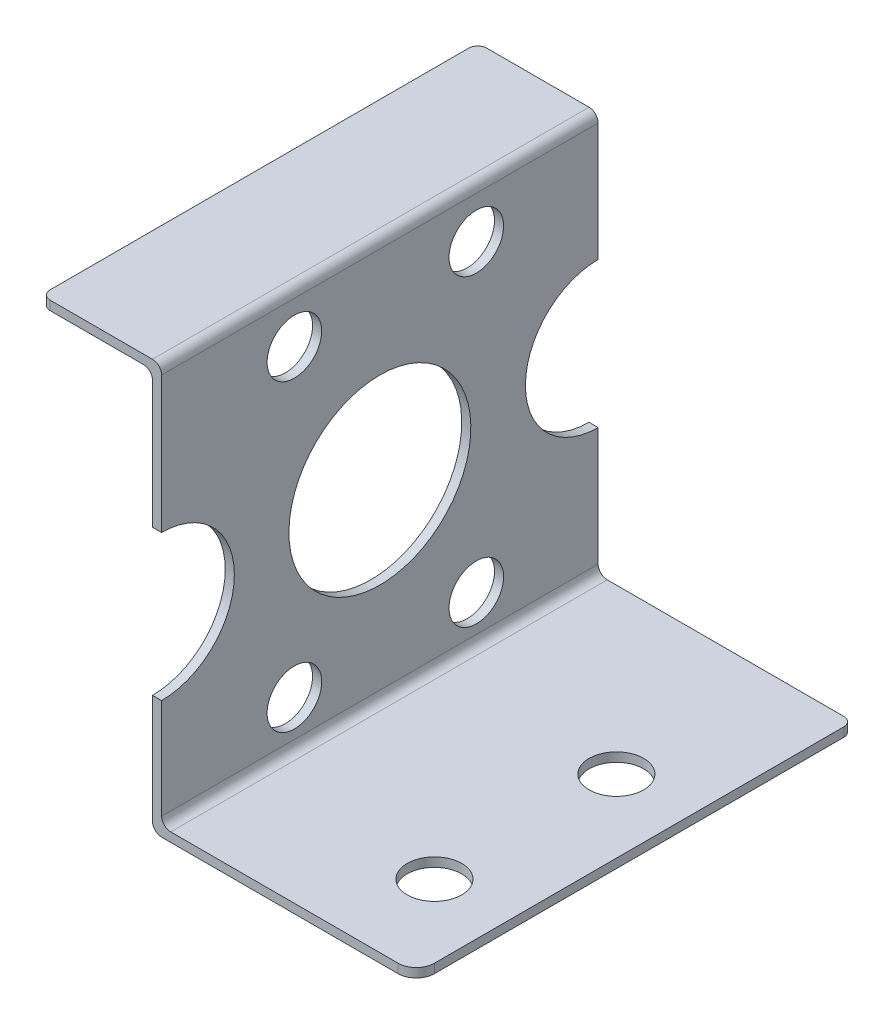
ISO-10303-21;
HEADER;
FILE_DESCRIPTION(('STEP AP214'),'2;1');
FILE_NAME('part.step','',(''),(''),'','','');
FILE_SCHEMA(('AUTOMOTIVE_DESIGN { 1 0 10303 214 1 1 1 1 }'));
ENDSEC;
DATA;
#1=APPLICATION_CONTEXT('core data for automotive mechanical design processes');
#2=APPLICATION_PROTOCOL_DEFINITION('international standard','automotive_design',2000,#1);
#3=PRODUCT_CONTEXT('',#1,'mechanical');
#4=PRODUCT('Part','Part','',(#3));
#5=PRODUCT_RELATED_PRODUCT_CATEGORY('part','',(#4));
#6=PRODUCT_DEFINITION_FORMATION('','',#4);
#7=PRODUCT_DEFINITION_CONTEXT('part definition',#1,'design');
#8=PRODUCT_DEFINITION('design','',#6,#7);
#9=PRODUCT_DEFINITION_SHAPE('','',#8);
#10=(LENGTH_UNIT() NAMED_UNIT(*) SI_UNIT(.MILLI.,.METRE.));
#11=(NAMED_UNIT(*) PLANE_ANGLE_UNIT() SI_UNIT($,.RADIAN.));
#12=(NAMED_UNIT(*) SI_UNIT($,.STERADIAN.) SOLID_ANGLE_UNIT());
#13=UNCERTAINTY_MEASURE_WITH_UNIT(LENGTH_MEASURE(1.E-05),#10,'distance_accuracy_value','');
#14=(GEOMETRIC_REPRESENTATION_CONTEXT(3) GLOBAL_UNCERTAINTY_ASSIGNED_CONTEXT((#13)) GLOBAL_UNIT_ASSIGNED_CONTEXT((#10,
#11,#12)) REPRESENTATION_CONTEXT('',''));
#15=CARTESIAN_POINT('',(0.,0.,0.));
#16=DIRECTION('',(0.,0.,1.));
#17=DIRECTION('',(1.,0.,0.));
#18=AXIS2_PLACEMENT_3D('',#15,#16,#17);
#19=CARTESIAN_POINT('',(0.,0.,24.));
#20=DIRECTION('',(0.,0.,-1.));
#21=DIRECTION('',(-1.,0.,0.));
#22=AXIS2_PLACEMENT_3D('',#19,#20,#21);
#23=PLANE('',#22);
#24=DIRECTION('',(0.,-1.,0.));
#25=VECTOR('',#24,1.);
#26=CARTESIAN_POINT('',(-0.5,22.,24.));
#27=LINE('',#26,#25);
#28=CARTESIAN_POINT('',(-0.5,21.,24.));
#29=VERTEX_POINT('',#28);
#30=CARTESIAN_POINT('',(-0.5,14.,24.));
#31=VERTEX_POINT('',#30);
#32=EDGE_CURVE('E215',#29,#31,#27,.T.);
#33=ORIENTED_EDGE('',*,*,#32,.T.);
#34=DIRECTION('',(1.,0.,0.));
#35=VECTOR('',#34,1.);
#36=CARTESIAN_POINT('',(-10.,14.,24.));
#37=LINE('',#36,#35);
#38=CARTESIAN_POINT('',(0.,14.,24.));
#39=VERTEX_POINT('',#38);
#40=EDGE_CURVE('E11',#31,#39,#37,.T.);
#41=ORIENTED_EDGE('',*,*,#40,.T.);
#42=DIRECTION('',(0.,-1.,0.));
#43=VECTOR('',#42,1.);
#44=CARTESIAN_POINT('',(0.,22.,24.));
#45=LINE('',#44,#43);
#46=CARTESIAN_POINT('',(0.,21.5,24.));
#47=VERTEX_POINT('',#46);
#48=EDGE_CURVE('E356',#47,#39,#45,.T.);
#49=ORIENTED_EDGE('',*,*,#48,.F.);
#50=CARTESIAN_POINT('',(-0.5,21.5,24.));
#51=DIRECTION('',(0.,0.,-1.));
#52=DIRECTION('',(-1.,0.,0.));
#53=AXIS2_PLACEMENT_3D('',#50,#51,#52);
#54=CIRCLE('',#53,0.5);
#55=CARTESIAN_POINT('',(-0.5,22.,24.));
#56=VERTEX_POINT('',#55);
#57=EDGE_CURVE('E311',#47,#56,#54,.F.);
#58=ORIENTED_EDGE('',*,*,#57,.T.);
#59=DIRECTION('',(1.,0.,0.));
#60=VECTOR('',#59,1.);
#61=CARTESIAN_POINT('',(0.,22.,24.));
#62=LINE('',#61,#60);
#63=CARTESIAN_POINT('',(-6.12101880948285,22.,24.));
#64=VERTEX_POINT('',#63);
#65=EDGE_CURVE('E334',#64,#56,#62,.T.);
#66=ORIENTED_EDGE('',*,*,#65,.F.);
#67=DIRECTION('',(0.,1.,0.));
#68=VECTOR('',#67,1.);
#69=CARTESIAN_POINT('',(-6.12101880948285,21.5,24.));
#70=LINE('',#69,#68);
#71=CARTESIAN_POINT('',(-6.12101880948285,21.5,24.));
#72=VERTEX_POINT('',#71);
#73=EDGE_CURVE('E269',#64,#72,#70,.F.);
#74=ORIENTED_EDGE('',*,*,#73,.T.);
#75=DIRECTION('',(1.,0.,0.));
#76=VECTOR('',#75,1.);
#77=CARTESIAN_POINT('',(0.,21.5,24.));
#78=LINE('',#77,#76);
#79=CARTESIAN_POINT('',(-1.,21.5,24.));
#80=VERTEX_POINT('',#79);
#81=EDGE_CURVE('E331',#72,#80,#78,.T.);
#82=ORIENTED_EDGE('',*,*,#81,.T.);
#83=CARTESIAN_POINT('',(-1.,21.,24.));
#84=DIRECTION('',(0.,0.,-1.));
#85=DIRECTION('',(-1.,0.,0.));
#86=AXIS2_PLACEMENT_3D('',#83,#84,#85);
#87=CIRCLE('',#86,0.5);
#88=EDGE_CURVE('E298',#80,#29,#87,.T.);
#89=ORIENTED_EDGE('',*,*,#88,.T.);
#90=EDGE_LOOP('',(#33,#41,#49,#58,#66,#74,#82,#89));
#91=FACE_BOUND('',#90,.T.);
#92=ADVANCED_FACE('F38',(#91),#23,.F.);
#93=CARTESIAN_POINT('',(0.,0.,0.));
#94=DIRECTION('',(0.,0.,-1.));
#95=DIRECTION('',(-1.,0.,0.));
#96=AXIS2_PLACEMENT_3D('',#93,#94,#95);
#97=PLANE('',#96);
#98=DIRECTION('',(1.,0.,0.));
#99=VECTOR('',#98,1.);
#100=CARTESIAN_POINT('',(-10.,15.,0.));
#101=LINE('',#100,#99);
#102=CARTESIAN_POINT('',(-0.5,15.,0.));
#103=VERTEX_POINT('',#102);
#104=CARTESIAN_POINT('',(0.,15.,0.));
#105=VERTEX_POINT('',#104);
#106=EDGE_CURVE('E173',#103,#105,#101,.T.);
#107=ORIENTED_EDGE('',*,*,#106,.F.);
#108=DIRECTION('',(0.,-1.,0.));
#109=VECTOR('',#108,1.);
#110=CARTESIAN_POINT('',(-0.5,22.,0.));
#111=LINE('',#110,#109);
#112=CARTESIAN_POINT('',(-0.5,21.,0.));
#113=VERTEX_POINT('',#112);
#114=EDGE_CURVE('E208',#113,#103,#111,.T.);
#115=ORIENTED_EDGE('',*,*,#114,.F.);
#116=CARTESIAN_POINT('',(-1.,21.,0.));
#117=DIRECTION('',(0.,0.,-1.));
#118=DIRECTION('',(-1.,0.,0.));
#119=AXIS2_PLACEMENT_3D('',#116,#117,#118);
#120=CIRCLE('',#119,0.5);
#121=CARTESIAN_POINT('',(-1.,21.5,0.));
#122=VERTEX_POINT('',#121);
#123=EDGE_CURVE('E296',#113,#122,#120,.F.);
#124=ORIENTED_EDGE('',*,*,#123,.T.);
#125=DIRECTION('',(1.,0.,0.));
#126=VECTOR('',#125,1.);
#127=CARTESIAN_POINT('',(0.,21.5,0.));
#128=LINE('',#127,#126);
#129=CARTESIAN_POINT('',(-6.12101880948285,21.5,0.));
#130=VERTEX_POINT('',#129);
#131=EDGE_CURVE('E199',#130,#122,#128,.T.);
#132=ORIENTED_EDGE('',*,*,#131,.F.);
#133=DIRECTION('',(0.,1.,0.));
#134=VECTOR('',#133,1.);
#135=CARTESIAN_POINT('',(-6.12101880948285,0.,0.));
#136=LINE('',#135,#134);
#137=CARTESIAN_POINT('',(-6.12101880948285,22.,0.));
#138=VERTEX_POINT('',#137);
#139=EDGE_CURVE('E257',#130,#138,#136,.T.);
#140=ORIENTED_EDGE('',*,*,#139,.T.);
#141=DIRECTION('',(1.,0.,0.));
#142=VECTOR('',#141,1.);
#143=CARTESIAN_POINT('',(0.,22.,0.));
#144=LINE('',#143,#142);
#145=CARTESIAN_POINT('',(-0.5,22.,0.));
#146=VERTEX_POINT('',#145);
#147=EDGE_CURVE('E197',#138,#146,#144,.T.);
#148=ORIENTED_EDGE('',*,*,#147,.T.);
#149=CARTESIAN_POINT('',(-0.5,21.5,0.));
#150=DIRECTION('',(0.,0.,-1.));
#151=DIRECTION('',(-1.,0.,0.));
#152=AXIS2_PLACEMENT_3D('',#149,#150,#151);
#153=CIRCLE('',#152,0.5);
#154=CARTESIAN_POINT('',(0.,21.5,0.));
#155=VERTEX_POINT('',#154);
#156=EDGE_CURVE('E196',#146,#155,#153,.T.);
#157=ORIENTED_EDGE('',*,*,#156,.T.);
#158=DIRECTION('',(0.,-1.,0.));
#159=VECTOR('',#158,1.);
#160=CARTESIAN_POINT('',(0.,22.,0.));
#161=LINE('',#160,#159);
#162=EDGE_CURVE('E188',#155,#105,#161,.T.);
#163=ORIENTED_EDGE('',*,*,#162,.T.);
#164=EDGE_LOOP('',(#107,#115,#124,#132,#140,#148,#157,#163));
#165=FACE_BOUND('',#164,.T.);
#166=ADVANCED_FACE('F194',(#165),#97,.T.);
#167=CARTESIAN_POINT('',(0.,-0.5,24.));
#168=DIRECTION('',(0.,1.,0.));
#169=DIRECTION('',(0.,0.,1.));
#170=AXIS2_PLACEMENT_3D('',#167,#168,#169);
#171=PLANE('',#170);
#172=CARTESIAN_POINT('',(10.,-0.5,19.));
#173=DIRECTION('',(0.,1.,0.));
#174=DIRECTION('',(0.,0.,1.));
#175=AXIS2_PLACEMENT_3D('',#172,#173,#174);
#176=CIRCLE('',#175,1.5);
#177=CARTESIAN_POINT('',(10.,-0.5,20.5));
#178=VERTEX_POINT('',#177);
#179=EDGE_CURVE('E339',#178,#178,#176,.T.);
#180=ORIENTED_EDGE('',*,*,#179,.T.);
#181=EDGE_LOOP('',(#180));
#182=FACE_BOUND('',#181,.T.);
#183=CARTESIAN_POINT('',(9.99999999999997,-0.5,9.));
#184=DIRECTION('',(0.,1.,0.));
#185=DIRECTION('',(0.,0.,1.));
#186=AXIS2_PLACEMENT_3D('',#183,#184,#185);
#187=CIRCLE('',#186,1.5);
#188=CARTESIAN_POINT('',(9.99999999999997,-0.5,10.5));
#189=VERTEX_POINT('',#188);
#190=EDGE_CURVE('E344',#189,#189,#187,.T.);
#191=ORIENTED_EDGE('',*,*,#190,.T.);
#192=EDGE_LOOP('',(#191));
#193=FACE_BOUND('',#192,.T.);
#194=DIRECTION('',(1.,0.,0.));
#195=VECTOR('',#194,1.);
#196=CARTESIAN_POINT('',(0.,-0.5,24.));
#197=LINE('',#196,#195);
#198=CARTESIAN_POINT('',(0.,-0.5,24.));
#199=VERTEX_POINT('',#198);
#200=CARTESIAN_POINT('',(13.,-0.5,24.));
#201=VERTEX_POINT('',#200);
#202=EDGE_CURVE('E210',#199,#201,#197,.T.);
#203=ORIENTED_EDGE('',*,*,#202,.F.);
#204=DIRECTION('',(0.,0.,-1.));
#205=VECTOR('',#204,1.);
#206=CARTESIAN_POINT('',(0.,-0.5,24.));
#207=LINE('',#206,#205);
#208=CARTESIAN_POINT('',(0.,-0.5,0.));
#209=VERTEX_POINT('',#208);
#210=EDGE_CURVE('E251',#199,#209,#207,.T.);
#211=ORIENTED_EDGE('',*,*,#210,.T.);
#212=DIRECTION('',(1.,0.,0.));
#213=VECTOR('',#212,1.);
#214=CARTESIAN_POINT('',(0.,-0.5,0.));
#215=LINE('',#214,#213);
#216=CARTESIAN_POINT('',(13.5,-0.5,0.));
#217=VERTEX_POINT('',#216);
#218=EDGE_CURVE('E337',#209,#217,#215,.T.);
#219=ORIENTED_EDGE('',*,*,#218,.T.);
#220=CARTESIAN_POINT('',(13.5,-0.5,0.5));
#221=DIRECTION('',(0.,1.,0.));
#222=DIRECTION('',(0.,0.,1.));
#223=AXIS2_PLACEMENT_3D('',#220,#221,#222);
#224=CIRCLE('',#223,0.5);
#225=CARTESIAN_POINT('',(14.,-0.5,0.5));
#226=VERTEX_POINT('',#225);
#227=EDGE_CURVE('E249',#217,#226,#224,.F.);
#228=ORIENTED_EDGE('',*,*,#227,.T.);
#229=DIRECTION('',(0.,0.,-1.));
#230=VECTOR('',#229,1.);
#231=CARTESIAN_POINT('',(14.,-0.5,24.));
#232=LINE('',#231,#230);
#233=CARTESIAN_POINT('',(14.,-0.5,23.));
#234=VERTEX_POINT('',#233);
#235=EDGE_CURVE('E221',#234,#226,#232,.T.);
#236=ORIENTED_EDGE('',*,*,#235,.F.);
#237=CARTESIAN_POINT('',(13.,-0.5,23.));
#238=DIRECTION('',(0.,1.,0.));
#239=DIRECTION('',(0.,0.,1.));
#240=AXIS2_PLACEMENT_3D('',#237,#238,#239);
#241=CIRCLE('',#240,1.);
#242=EDGE_CURVE('E241',#234,#201,#241,.F.);
#243=ORIENTED_EDGE('',*,*,#242,.T.);
#244=EDGE_LOOP('',(#203,#211,#219,#228,#236,#243));
#245=FACE_BOUND('',#244,.T.);
#246=ADVANCED_FACE('F421',(#182,#193,#245),#171,.F.);
#247=CARTESIAN_POINT('',(14.,0.,24.));
#248=DIRECTION('',(1.,0.,0.));
#249=DIRECTION('',(0.,0.,-1.));
#250=AXIS2_PLACEMENT_3D('',#247,#248,#249);
#251=PLANE('',#250);
#252=ORIENTED_EDGE('',*,*,#235,.T.);
#253=DIRECTION('',(0.,-1.,0.));
#254=VECTOR('',#253,1.);
#255=CARTESIAN_POINT('',(14.,0.,0.5));
#256=LINE('',#255,#254);
#257=CARTESIAN_POINT('',(14.,0.,0.5));
#258=VERTEX_POINT('',#257);
#259=EDGE_CURVE('E294',#226,#258,#256,.F.);
#260=ORIENTED_EDGE('',*,*,#259,.T.);
#261=DIRECTION('',(0.,0.,-1.));
#262=VECTOR('',#261,1.);
#263=CARTESIAN_POINT('',(14.,0.,24.));
#264=LINE('',#263,#262);
#265=CARTESIAN_POINT('',(14.,0.,23.));
#266=VERTEX_POINT('',#265);
#267=EDGE_CURVE('E218',#266,#258,#264,.T.);
#268=ORIENTED_EDGE('',*,*,#267,.F.);
#269=DIRECTION('',(0.,-1.,0.));
#270=VECTOR('',#269,1.);
#271=CARTESIAN_POINT('',(14.,-0.5,23.));
#272=LINE('',#271,#270);
#273=EDGE_CURVE('E224',#266,#234,#272,.T.);
#274=ORIENTED_EDGE('',*,*,#273,.T.);
#275=EDGE_LOOP('',(#252,#260,#268,#274));
#276=FACE_BOUND('',#275,.T.);
#277=ADVANCED_FACE('F397',(#276),#251,.T.);
#278=CARTESIAN_POINT('',(0.,0.,24.));
#279=DIRECTION('',(0.,1.,0.));
#280=DIRECTION('',(0.,0.,1.));
#281=AXIS2_PLACEMENT_3D('',#278,#279,#280);
#282=PLANE('',#281);
#283=CARTESIAN_POINT('',(10.,0.,19.));
#284=DIRECTION('',(0.,1.,0.));
#285=DIRECTION('',(0.,0.,1.));
#286=AXIS2_PLACEMENT_3D('',#283,#284,#285);
#287=CIRCLE('',#286,1.5);
#288=CARTESIAN_POINT('',(10.,0.,20.5));
#289=VERTEX_POINT('',#288);
#290=EDGE_CURVE('E349',#289,#289,#287,.T.);
#291=ORIENTED_EDGE('',*,*,#290,.F.);
#292=EDGE_LOOP('',(#291));
#293=FACE_BOUND('',#292,.T.);
#294=CARTESIAN_POINT('',(9.99999999999997,0.,9.));
#295=DIRECTION('',(0.,1.,0.));
#296=DIRECTION('',(0.,0.,1.));
#297=AXIS2_PLACEMENT_3D('',#294,#295,#296);
#298=CIRCLE('',#297,1.5);
#299=CARTESIAN_POINT('',(9.99999999999997,0.,10.5));
#300=VERTEX_POINT('',#299);
#301=EDGE_CURVE('E238',#300,#300,#298,.T.);
#302=ORIENTED_EDGE('',*,*,#301,.F.);
#303=EDGE_LOOP('',(#302));
#304=FACE_BOUND('',#303,.T.);
#305=DIRECTION('',(1.,0.,0.));
#306=VECTOR('',#305,1.);
#307=CARTESIAN_POINT('',(0.,0.,0.));
#308=LINE('',#307,#306);
#309=CARTESIAN_POINT('',(0.5,0.,0.));
#310=VERTEX_POINT('',#309);
#311=CARTESIAN_POINT('',(13.5,0.,0.));
#312=VERTEX_POINT('',#311);
#313=EDGE_CURVE('E201',#310,#312,#308,.T.);
#314=ORIENTED_EDGE('',*,*,#313,.F.);
#315=DIRECTION('',(0.,0.,-1.));
#316=VECTOR('',#315,1.);
#317=CARTESIAN_POINT('',(0.5,0.,24.));
#318=LINE('',#317,#316);
#319=CARTESIAN_POINT('',(0.5,0.,24.));
#320=VERTEX_POINT('',#319);
#321=EDGE_CURVE('E292',#310,#320,#318,.F.);
#322=ORIENTED_EDGE('',*,*,#321,.T.);
#323=DIRECTION('',(1.,0.,0.));
#324=VECTOR('',#323,1.);
#325=CARTESIAN_POINT('',(0.,0.,24.));
#326=LINE('',#325,#324);
#327=CARTESIAN_POINT('',(13.,0.,24.));
#328=VERTEX_POINT('',#327);
#329=EDGE_CURVE('E354',#320,#328,#326,.T.);
#330=ORIENTED_EDGE('',*,*,#329,.T.);
#331=CARTESIAN_POINT('',(13.,0.,23.));
#332=DIRECTION('',(0.,1.,0.));
#333=DIRECTION('',(0.,0.,1.));
#334=AXIS2_PLACEMENT_3D('',#331,#332,#333);
#335=CIRCLE('',#334,1.);
#336=EDGE_CURVE('E247',#328,#266,#335,.T.);
#337=ORIENTED_EDGE('',*,*,#336,.T.);
#338=ORIENTED_EDGE('',*,*,#267,.T.);
#339=CARTESIAN_POINT('',(13.5,0.,0.5));
#340=DIRECTION('',(0.,1.,0.));
#341=DIRECTION('',(0.,0.,1.));
#342=AXIS2_PLACEMENT_3D('',#339,#340,#341);
#343=CIRCLE('',#342,0.5);
#344=EDGE_CURVE('E290',#258,#312,#343,.T.);
#345=ORIENTED_EDGE('',*,*,#344,.T.);
#346=EDGE_LOOP('',(#314,#322,#330,#337,#338,#345));
#347=FACE_BOUND('',#346,.T.);
#348=ADVANCED_FACE('F394',(#293,#304,#347),#282,.T.);
#349=CARTESIAN_POINT('',(0.,22.,24.));
#350=DIRECTION('',(1.,0.,0.));
#351=DIRECTION('',(0.,1.,0.));
#352=AXIS2_PLACEMENT_3D('',#349,#350,#351);
#353=PLANE('',#352);
#354=CARTESIAN_POINT('',(0.,11.,0.));
#355=DIRECTION('',(1.,0.,0.));
#356=DIRECTION('',(0.,1.,0.));
#357=AXIS2_PLACEMENT_3D('',#354,#355,#356);
#358=CIRCLE('',#357,4.);
#359=CARTESIAN_POINT('',(0.,7.,0.));
#360=VERTEX_POINT('',#359);
#361=EDGE_CURVE('E61',#105,#360,#358,.T.);
#362=ORIENTED_EDGE('',*,*,#361,.F.);
#363=ORIENTED_EDGE('',*,*,#162,.F.);
#364=DIRECTION('',(0.,0.,-1.));
#365=VECTOR('',#364,1.);
#366=CARTESIAN_POINT('',(0.,21.5,24.));
#367=LINE('',#366,#365);
#368=EDGE_CURVE('E309',#155,#47,#367,.F.);
#369=ORIENTED_EDGE('',*,*,#368,.T.);
#370=ORIENTED_EDGE('',*,*,#48,.T.);
#371=CARTESIAN_POINT('',(0.,10.,24.));
#372=DIRECTION('',(1.,0.,0.));
#373=DIRECTION('',(0.,-1.,0.));
#374=AXIS2_PLACEMENT_3D('',#371,#372,#373);
#375=CIRCLE('',#374,4.);
#376=CARTESIAN_POINT('',(0.,6.,24.));
#377=VERTEX_POINT('',#376);
#378=EDGE_CURVE('E192',#377,#39,#375,.T.);
#379=ORIENTED_EDGE('',*,*,#378,.F.);
#380=CARTESIAN_POINT('',(0.,0.5,24.));
#381=VERTEX_POINT('',#380);
#382=EDGE_CURVE('E323',#377,#381,#45,.T.);
#383=ORIENTED_EDGE('',*,*,#382,.T.);
#384=DIRECTION('',(0.,0.,-1.));
#385=VECTOR('',#384,1.);
#386=CARTESIAN_POINT('',(0.,0.5,0.));
#387=LINE('',#386,#385);
#388=CARTESIAN_POINT('',(0.,0.5,0.));
#389=VERTEX_POINT('',#388);
#390=EDGE_CURVE('E288',#381,#389,#387,.T.);
#391=ORIENTED_EDGE('',*,*,#390,.T.);
#392=EDGE_CURVE('E191',#360,#389,#161,.T.);
#393=ORIENTED_EDGE('',*,*,#392,.F.);
#394=EDGE_LOOP('',(#362,#363,#369,#370,#379,#383,#391,#393));
#395=FACE_BOUND('',#394,.T.);
#396=CARTESIAN_POINT('',(0.,10.5,12.));
#397=DIRECTION('',(1.,0.,0.));
#398=DIRECTION('',(0.,1.,0.));
#399=AXIS2_PLACEMENT_3D('',#396,#397,#398);
#400=CIRCLE('',#399,5.);
#401=CARTESIAN_POINT('',(0.,15.5,12.));
#402=VERTEX_POINT('',#401);
#403=EDGE_CURVE('E317',#402,#402,#400,.T.);
#404=ORIENTED_EDGE('',*,*,#403,.F.);
#405=EDGE_LOOP('',(#404));
#406=FACE_BOUND('',#405,.T.);
#407=CARTESIAN_POINT('',(0.,2.5,16.6999999999998));
#408=DIRECTION('',(1.,0.,0.));
#409=DIRECTION('',(0.,0.,-1.));
#410=AXIS2_PLACEMENT_3D('',#407,#408,#409);
#411=CIRCLE('',#410,1.5);
#412=CARTESIAN_POINT('',(0.,2.5,15.1999999999998));
#413=VERTEX_POINT('',#412);
#414=EDGE_CURVE('E380',#413,#413,#411,.T.);
#415=ORIENTED_EDGE('',*,*,#414,.F.);
#416=EDGE_LOOP('',(#415));
#417=FACE_BOUND('',#416,.T.);
#418=CARTESIAN_POINT('',(0.,19.2,6.7));
#419=DIRECTION('',(1.,0.,0.));
#420=DIRECTION('',(0.,0.,-1.));
#421=AXIS2_PLACEMENT_3D('',#418,#419,#420);
#422=CIRCLE('',#421,1.5);
#423=CARTESIAN_POINT('',(0.,19.2,5.2));
#424=VERTEX_POINT('',#423);
#425=EDGE_CURVE('E379',#424,#424,#422,.T.);
#426=ORIENTED_EDGE('',*,*,#425,.F.);
#427=EDGE_LOOP('',(#426));
#428=FACE_BOUND('',#427,.T.);
#429=CARTESIAN_POINT('',(0.,2.5,6.69999999999982));
#430=DIRECTION('',(1.,0.,0.));
#431=DIRECTION('',(0.,0.,-1.));
#432=AXIS2_PLACEMENT_3D('',#429,#430,#431);
#433=CIRCLE('',#432,1.5);
#434=CARTESIAN_POINT('',(0.,2.5,5.19999999999982));
#435=VERTEX_POINT('',#434);
#436=EDGE_CURVE('E316',#435,#435,#433,.T.);
#437=ORIENTED_EDGE('',*,*,#436,.F.);
#438=EDGE_LOOP('',(#437));
#439=FACE_BOUND('',#438,.T.);
#440=CARTESIAN_POINT('',(0.,19.2,16.7));
#441=DIRECTION('',(1.,0.,0.));
#442=DIRECTION('',(0.,0.,-1.));
#443=AXIS2_PLACEMENT_3D('',#440,#441,#442);
#444=CIRCLE('',#443,1.5);
#445=CARTESIAN_POINT('',(0.,19.2,15.2));
#446=VERTEX_POINT('',#445);
#447=EDGE_CURVE('E229',#446,#446,#444,.T.);
#448=ORIENTED_EDGE('',*,*,#447,.F.);
#449=EDGE_LOOP('',(#448));
#450=FACE_BOUND('',#449,.T.);
#451=ADVANCED_FACE('F186',(#395,#406,#417,#428,#439,#450),#353,.T.);
#452=CARTESIAN_POINT('',(0.,22.,24.));
#453=DIRECTION('',(0.,1.,0.));
#454=DIRECTION('',(0.,0.,1.));
#455=AXIS2_PLACEMENT_3D('',#452,#453,#454);
#456=PLANE('',#455);
#457=ORIENTED_EDGE('',*,*,#65,.T.);
#458=DIRECTION('',(0.,0.,-1.));
#459=VECTOR('',#458,1.);
#460=CARTESIAN_POINT('',(-0.5,22.,24.));
#461=LINE('',#460,#459);
#462=EDGE_CURVE('E305',#56,#146,#461,.T.);
#463=ORIENTED_EDGE('',*,*,#462,.T.);
#464=ORIENTED_EDGE('',*,*,#147,.F.);
#465=CARTESIAN_POINT('',(-6.12101880948285,22.,0.5));
#466=DIRECTION('',(0.,1.,0.));
#467=DIRECTION('',(0.,0.,1.));
#468=AXIS2_PLACEMENT_3D('',#465,#466,#467);
#469=CIRCLE('',#468,0.5);
#470=CARTESIAN_POINT('',(-6.62101880948285,22.,0.5));
#471=VERTEX_POINT('',#470);
#472=EDGE_CURVE('E284',#138,#471,#469,.T.);
#473=ORIENTED_EDGE('',*,*,#472,.T.);
#474=DIRECTION('',(0.,0.,-1.));
#475=VECTOR('',#474,1.);
#476=CARTESIAN_POINT('',(-6.62101880948285,22.,24.));
#477=LINE('',#476,#475);
#478=CARTESIAN_POINT('',(-6.62101880948285,22.,23.5));
#479=VERTEX_POINT('',#478);
#480=EDGE_CURVE('E214',#479,#471,#477,.T.);
#481=ORIENTED_EDGE('',*,*,#480,.F.);
#482=CARTESIAN_POINT('',(-6.12101880948285,22.,23.5));
#483=DIRECTION('',(0.,1.,0.));
#484=DIRECTION('',(0.,0.,1.));
#485=AXIS2_PLACEMENT_3D('',#482,#483,#484);
#486=CIRCLE('',#485,0.5);
#487=EDGE_CURVE('E286',#479,#64,#486,.T.);
#488=ORIENTED_EDGE('',*,*,#487,.T.);
#489=EDGE_LOOP('',(#457,#463,#464,#473,#481,#488));
#490=FACE_BOUND('',#489,.T.);
#491=ADVANCED_FACE('F362',(#490),#456,.T.);
#492=CARTESIAN_POINT('',(-6.62101880948285,21.5,24.));
#493=DIRECTION('',(-1.,0.,0.));
#494=DIRECTION('',(0.,0.,1.));
#495=AXIS2_PLACEMENT_3D('',#492,#493,#494);
#496=PLANE('',#495);
#497=DIRECTION('',(0.,0.,-1.));
#498=VECTOR('',#497,1.);
#499=CARTESIAN_POINT('',(-6.62101880948285,21.5,24.));
#500=LINE('',#499,#498);
#501=CARTESIAN_POINT('',(-6.62101880948285,21.5,23.5));
#502=VERTEX_POINT('',#501);
#503=CARTESIAN_POINT('',(-6.62101880948285,21.5,0.5));
#504=VERTEX_POINT('',#503);
#505=EDGE_CURVE('E211',#502,#504,#500,.T.);
#506=ORIENTED_EDGE('',*,*,#505,.F.);
#507=DIRECTION('',(0.,1.,0.));
#508=VECTOR('',#507,1.);
#509=CARTESIAN_POINT('',(-6.62101880948285,22.,23.5));
#510=LINE('',#509,#508);
#511=EDGE_CURVE('E281',#502,#479,#510,.T.);
#512=ORIENTED_EDGE('',*,*,#511,.T.);
#513=ORIENTED_EDGE('',*,*,#480,.T.);
#514=DIRECTION('',(0.,1.,0.));
#515=VECTOR('',#514,1.);
#516=CARTESIAN_POINT('',(-6.62101880948285,21.5,0.5));
#517=LINE('',#516,#515);
#518=EDGE_CURVE('E279',#471,#504,#517,.F.);
#519=ORIENTED_EDGE('',*,*,#518,.T.);
#520=EDGE_LOOP('',(#506,#512,#513,#519));
#521=FACE_BOUND('',#520,.T.);
#522=ADVANCED_FACE('F459',(#521),#496,.T.);
#523=CARTESIAN_POINT('',(0.,21.5,24.));
#524=DIRECTION('',(0.,1.,0.));
#525=DIRECTION('',(0.,0.,1.));
#526=AXIS2_PLACEMENT_3D('',#523,#524,#525);
#527=PLANE('',#526);
#528=ORIENTED_EDGE('',*,*,#131,.T.);
#529=DIRECTION('',(0.,0.,-1.));
#530=VECTOR('',#529,1.);
#531=CARTESIAN_POINT('',(-1.,21.5,24.));
#532=LINE('',#531,#530);
#533=EDGE_CURVE('E277',#122,#80,#532,.F.);
#534=ORIENTED_EDGE('',*,*,#533,.T.);
#535=ORIENTED_EDGE('',*,*,#81,.F.);
#536=CARTESIAN_POINT('',(-6.12101880948285,21.5,23.5));
#537=DIRECTION('',(0.,1.,0.));
#538=DIRECTION('',(0.,0.,1.));
#539=AXIS2_PLACEMENT_3D('',#536,#537,#538);
#540=CIRCLE('',#539,0.5);
#541=EDGE_CURVE('E275',#72,#502,#540,.F.);
#542=ORIENTED_EDGE('',*,*,#541,.T.);
#543=ORIENTED_EDGE('',*,*,#505,.T.);
#544=CARTESIAN_POINT('',(-6.12101880948285,21.5,0.5));
#545=DIRECTION('',(0.,1.,0.));
#546=DIRECTION('',(0.,0.,1.));
#547=AXIS2_PLACEMENT_3D('',#544,#545,#546);
#548=CIRCLE('',#547,0.5);
#549=EDGE_CURVE('E273',#504,#130,#548,.F.);
#550=ORIENTED_EDGE('',*,*,#549,.T.);
#551=EDGE_LOOP('',(#528,#534,#535,#542,#543,#550));
#552=FACE_BOUND('',#551,.T.);
#553=ADVANCED_FACE('F453',(#552),#527,.F.);
#554=CARTESIAN_POINT('',(-0.5,22.,24.));
#555=DIRECTION('',(1.,0.,0.));
#556=DIRECTION('',(0.,1.,0.));
#557=AXIS2_PLACEMENT_3D('',#554,#555,#556);
#558=PLANE('',#557);
#559=CARTESIAN_POINT('',(-0.5,10.5,12.));
#560=DIRECTION('',(1.,0.,0.));
#561=DIRECTION('',(0.,1.,0.));
#562=AXIS2_PLACEMENT_3D('',#559,#560,#561);
#563=CIRCLE('',#562,5.);
#564=CARTESIAN_POINT('',(-0.5,15.5,12.));
#565=VERTEX_POINT('',#564);
#566=EDGE_CURVE('E313',#565,#565,#563,.T.);
#567=ORIENTED_EDGE('',*,*,#566,.T.);
#568=EDGE_LOOP('',(#567));
#569=FACE_BOUND('',#568,.T.);
#570=CARTESIAN_POINT('',(-0.5,2.5,16.6999999999998));
#571=DIRECTION('',(1.,0.,0.));
#572=DIRECTION('',(0.,1.,0.));
#573=AXIS2_PLACEMENT_3D('',#570,#571,#572);
#574=CIRCLE('',#573,1.5);
#575=CARTESIAN_POINT('',(-0.5,4.,16.6999999999998));
#576=VERTEX_POINT('',#575);
#577=EDGE_CURVE('E235',#576,#576,#574,.T.);
#578=ORIENTED_EDGE('',*,*,#577,.T.);
#579=EDGE_LOOP('',(#578));
#580=FACE_BOUND('',#579,.T.);
#581=CARTESIAN_POINT('',(-0.5,19.2,6.7));
#582=DIRECTION('',(1.,0.,0.));
#583=DIRECTION('',(0.,1.,0.));
#584=AXIS2_PLACEMENT_3D('',#581,#582,#583);
#585=CIRCLE('',#584,1.5);
#586=CARTESIAN_POINT('',(-0.5,20.7,6.7));
#587=VERTEX_POINT('',#586);
#588=EDGE_CURVE('E232',#587,#587,#585,.T.);
#589=ORIENTED_EDGE('',*,*,#588,.T.);
#590=EDGE_LOOP('',(#589));
#591=FACE_BOUND('',#590,.T.);
#592=CARTESIAN_POINT('',(-0.5,2.5,6.69999999999982));
#593=DIRECTION('',(1.,0.,0.));
#594=DIRECTION('',(0.,1.,0.));
#595=AXIS2_PLACEMENT_3D('',#592,#593,#594);
#596=CIRCLE('',#595,1.5);
#597=CARTESIAN_POINT('',(-0.5,4.,6.69999999999982));
#598=VERTEX_POINT('',#597);
#599=EDGE_CURVE('E228',#598,#598,#596,.T.);
#600=ORIENTED_EDGE('',*,*,#599,.T.);
#601=EDGE_LOOP('',(#600));
#602=FACE_BOUND('',#601,.T.);
#603=CARTESIAN_POINT('',(-0.5,19.2,16.7));
#604=DIRECTION('',(1.,0.,0.));
#605=DIRECTION('',(0.,1.,0.));
#606=AXIS2_PLACEMENT_3D('',#603,#604,#605);
#607=CIRCLE('',#606,1.5);
#608=CARTESIAN_POINT('',(-0.5,20.7,16.7));
#609=VERTEX_POINT('',#608);
#610=EDGE_CURVE('E225',#609,#609,#607,.T.);
#611=ORIENTED_EDGE('',*,*,#610,.T.);
#612=EDGE_LOOP('',(#611));
#613=FACE_BOUND('',#612,.T.);
#614=ORIENTED_EDGE('',*,*,#114,.T.);
#615=CARTESIAN_POINT('',(-0.5,11.,0.));
#616=DIRECTION('',(1.,0.,0.));
#617=DIRECTION('',(0.,1.,0.));
#618=AXIS2_PLACEMENT_3D('',#615,#616,#617);
#619=CIRCLE('',#618,4.);
#620=CARTESIAN_POINT('',(-0.5,7.,0.));
#621=VERTEX_POINT('',#620);
#622=EDGE_CURVE('E176',#103,#621,#619,.T.);
#623=ORIENTED_EDGE('',*,*,#622,.T.);
#624=CARTESIAN_POINT('',(-0.5,0.,0.));
#625=VERTEX_POINT('',#624);
#626=EDGE_CURVE('E207',#621,#625,#111,.T.);
#627=ORIENTED_EDGE('',*,*,#626,.T.);
#628=DIRECTION('',(0.,0.,-1.));
#629=VECTOR('',#628,1.);
#630=CARTESIAN_POINT('',(-0.5,0.,24.));
#631=LINE('',#630,#629);
#632=CARTESIAN_POINT('',(-0.5,0.,24.));
#633=VERTEX_POINT('',#632);
#634=EDGE_CURVE('E266',#625,#633,#631,.F.);
#635=ORIENTED_EDGE('',*,*,#634,.T.);
#636=CARTESIAN_POINT('',(-0.5,6.,24.));
#637=VERTEX_POINT('',#636);
#638=EDGE_CURVE('E322',#637,#633,#27,.T.);
#639=ORIENTED_EDGE('',*,*,#638,.F.);
#640=CARTESIAN_POINT('',(-0.5,10.,24.));
#641=DIRECTION('',(1.,0.,0.));
#642=DIRECTION('',(0.,1.,0.));
#643=AXIS2_PLACEMENT_3D('',#640,#641,#642);
#644=CIRCLE('',#643,4.);
#645=EDGE_CURVE('E53',#637,#31,#644,.T.);
#646=ORIENTED_EDGE('',*,*,#645,.T.);
#647=ORIENTED_EDGE('',*,*,#32,.F.);
#648=DIRECTION('',(0.,0.,-1.));
#649=VECTOR('',#648,1.);
#650=CARTESIAN_POINT('',(-0.5,21.,0.));
#651=LINE('',#650,#649);
#652=EDGE_CURVE('E263',#29,#113,#651,.T.);
#653=ORIENTED_EDGE('',*,*,#652,.T.);
#654=EDGE_LOOP('',(#614,#623,#627,#635,#639,#646,#647,#653));
#655=FACE_BOUND('',#654,.T.);
#656=ADVANCED_FACE('F326',(#569,#580,#591,#602,#613,#655),#558,.F.);
#657=ORIENTED_EDGE('',*,*,#382,.F.);
#658=DIRECTION('',(1.,0.,0.));
#659=VECTOR('',#658,1.);
#660=CARTESIAN_POINT('',(-10.,6.,24.));
#661=LINE('',#660,#659);
#662=EDGE_CURVE('E46',#377,#637,#661,.F.);
#663=ORIENTED_EDGE('',*,*,#662,.T.);
#664=ORIENTED_EDGE('',*,*,#638,.T.);
#665=CARTESIAN_POINT('',(0.,0.,24.));
#666=DIRECTION('',(0.,0.,-1.));
#667=DIRECTION('',(-1.,0.,0.));
#668=AXIS2_PLACEMENT_3D('',#665,#666,#667);
#669=CIRCLE('',#668,0.5);
#670=EDGE_CURVE('E271',#633,#199,#669,.F.);
#671=ORIENTED_EDGE('',*,*,#670,.T.);
#672=ORIENTED_EDGE('',*,*,#202,.T.);
#673=DIRECTION('',(0.,-1.,0.));
#674=VECTOR('',#673,1.);
#675=CARTESIAN_POINT('',(13.,0.,24.));
#676=LINE('',#675,#674);
#677=EDGE_CURVE('E244',#201,#328,#676,.F.);
#678=ORIENTED_EDGE('',*,*,#677,.T.);
#679=ORIENTED_EDGE('',*,*,#329,.F.);
#680=CARTESIAN_POINT('',(0.5,0.5,24.));
#681=DIRECTION('',(0.,0.,-1.));
#682=DIRECTION('',(-1.,0.,0.));
#683=AXIS2_PLACEMENT_3D('',#680,#681,#682);
#684=CIRCLE('',#683,0.5);
#685=EDGE_CURVE('E302',#320,#381,#684,.T.);
#686=ORIENTED_EDGE('',*,*,#685,.T.);
#687=EDGE_LOOP('',(#657,#663,#664,#671,#672,#678,#679,#686));
#688=FACE_BOUND('',#687,.T.);
#689=ADVANCED_FACE('F321',(#688),#23,.F.);
#690=DIRECTION('',(1.,0.,0.));
#691=VECTOR('',#690,1.);
#692=CARTESIAN_POINT('',(-10.,7.,0.));
#693=LINE('',#692,#691);
#694=EDGE_CURVE('E181',#360,#621,#693,.F.);
#695=ORIENTED_EDGE('',*,*,#694,.F.);
#696=ORIENTED_EDGE('',*,*,#392,.T.);
#697=CARTESIAN_POINT('',(0.5,0.5,0.));
#698=DIRECTION('',(0.,0.,-1.));
#699=DIRECTION('',(-1.,0.,0.));
#700=AXIS2_PLACEMENT_3D('',#697,#698,#699);
#701=CIRCLE('',#700,0.5);
#702=EDGE_CURVE('E300',#389,#310,#701,.F.);
#703=ORIENTED_EDGE('',*,*,#702,.T.);
#704=ORIENTED_EDGE('',*,*,#313,.T.);
#705=DIRECTION('',(0.,-1.,0.));
#706=VECTOR('',#705,1.);
#707=CARTESIAN_POINT('',(13.5,0.,0.));
#708=LINE('',#707,#706);
#709=EDGE_CURVE('E254',#312,#217,#708,.T.);
#710=ORIENTED_EDGE('',*,*,#709,.T.);
#711=ORIENTED_EDGE('',*,*,#218,.F.);
#712=CARTESIAN_POINT('',(0.,0.,0.));
#713=DIRECTION('',(0.,0.,-1.));
#714=DIRECTION('',(-1.,0.,0.));
#715=AXIS2_PLACEMENT_3D('',#712,#713,#714);
#716=CIRCLE('',#715,0.5);
#717=EDGE_CURVE('E260',#209,#625,#716,.T.);
#718=ORIENTED_EDGE('',*,*,#717,.T.);
#719=ORIENTED_EDGE('',*,*,#626,.F.);
#720=EDGE_LOOP('',(#695,#696,#703,#704,#710,#711,#718,#719));
#721=FACE_BOUND('',#720,.T.);
#722=ADVANCED_FACE('F425',(#721),#97,.T.);
#723=CARTESIAN_POINT('',(9.99999999999997,-10.,9.));
#724=DIRECTION('',(0.,1.,0.));
#725=DIRECTION('',(0.,0.,1.));
#726=AXIS2_PLACEMENT_3D('',#723,#724,#725);
#727=CYLINDRICAL_SURFACE('',#726,1.5);
#728=ORIENTED_EDGE('',*,*,#301,.T.);
#729=EDGE_LOOP('',(#728));
#730=FACE_BOUND('',#729,.T.);
#731=ORIENTED_EDGE('',*,*,#190,.F.);
#732=EDGE_LOOP('',(#731));
#733=FACE_BOUND('',#732,.T.);
#734=ADVANCED_FACE('F391',(#730,#733),#727,.F.);
#735=CARTESIAN_POINT('',(10.,-10.,19.));
#736=DIRECTION('',(0.,1.,0.));
#737=DIRECTION('',(0.,0.,1.));
#738=AXIS2_PLACEMENT_3D('',#735,#736,#737);
#739=CYLINDRICAL_SURFACE('',#738,1.5);
#740=ORIENTED_EDGE('',*,*,#290,.T.);
#741=EDGE_LOOP('',(#740));
#742=FACE_BOUND('',#741,.T.);
#743=ORIENTED_EDGE('',*,*,#179,.F.);
#744=EDGE_LOOP('',(#743));
#745=FACE_BOUND('',#744,.T.);
#746=ADVANCED_FACE('F479',(#742,#745),#739,.F.);
#747=CARTESIAN_POINT('',(-10.,19.2,16.7));
#748=DIRECTION('',(1.,0.,0.));
#749=DIRECTION('',(0.,0.,-1.));
#750=AXIS2_PLACEMENT_3D('',#747,#748,#749);
#751=CYLINDRICAL_SURFACE('',#750,1.5);
#752=ORIENTED_EDGE('',*,*,#447,.T.);
#753=EDGE_LOOP('',(#752));
#754=FACE_BOUND('',#753,.T.);
#755=ORIENTED_EDGE('',*,*,#610,.F.);
#756=EDGE_LOOP('',(#755));
#757=FACE_BOUND('',#756,.T.);
#758=ADVANCED_FACE('F483',(#754,#757),#751,.F.);
#759=CARTESIAN_POINT('',(-10.,2.5,6.69999999999982));
#760=DIRECTION('',(1.,0.,0.));
#761=DIRECTION('',(0.,0.,-1.));
#762=AXIS2_PLACEMENT_3D('',#759,#760,#761);
#763=CYLINDRICAL_SURFACE('',#762,1.5);
#764=ORIENTED_EDGE('',*,*,#436,.T.);
#765=EDGE_LOOP('',(#764));
#766=FACE_BOUND('',#765,.T.);
#767=ORIENTED_EDGE('',*,*,#599,.F.);
#768=EDGE_LOOP('',(#767));
#769=FACE_BOUND('',#768,.T.);
#770=ADVANCED_FACE('F489',(#766,#769),#763,.F.);
#771=CARTESIAN_POINT('',(-10.,19.2,6.7));
#772=DIRECTION('',(1.,0.,0.));
#773=DIRECTION('',(0.,0.,-1.));
#774=AXIS2_PLACEMENT_3D('',#771,#772,#773);
#775=CYLINDRICAL_SURFACE('',#774,1.5);
#776=ORIENTED_EDGE('',*,*,#425,.T.);
#777=EDGE_LOOP('',(#776));
#778=FACE_BOUND('',#777,.T.);
#779=ORIENTED_EDGE('',*,*,#588,.F.);
#780=EDGE_LOOP('',(#779));
#781=FACE_BOUND('',#780,.T.);
#782=ADVANCED_FACE('F491',(#778,#781),#775,.F.);
#783=CARTESIAN_POINT('',(-10.,2.5,16.6999999999998));
#784=DIRECTION('',(1.,0.,0.));
#785=DIRECTION('',(0.,0.,-1.));
#786=AXIS2_PLACEMENT_3D('',#783,#784,#785);
#787=CYLINDRICAL_SURFACE('',#786,1.5);
#788=ORIENTED_EDGE('',*,*,#414,.T.);
#789=EDGE_LOOP('',(#788));
#790=FACE_BOUND('',#789,.T.);
#791=ORIENTED_EDGE('',*,*,#577,.F.);
#792=EDGE_LOOP('',(#791));
#793=FACE_BOUND('',#792,.T.);
#794=ADVANCED_FACE('F439',(#790,#793),#787,.F.);
#795=CARTESIAN_POINT('',(13.,0.,23.));
#796=DIRECTION('',(0.,1.,0.));
#797=DIRECTION('',(0.,0.,1.));
#798=AXIS2_PLACEMENT_3D('',#795,#796,#797);
#799=CYLINDRICAL_SURFACE('',#798,1.);
#800=ORIENTED_EDGE('',*,*,#336,.F.);
#801=ORIENTED_EDGE('',*,*,#677,.F.);
#802=ORIENTED_EDGE('',*,*,#242,.F.);
#803=ORIENTED_EDGE('',*,*,#273,.F.);
#804=EDGE_LOOP('',(#800,#801,#802,#803));
#805=FACE_BOUND('',#804,.T.);
#806=ADVANCED_FACE('F419',(#805),#799,.T.);
#807=CARTESIAN_POINT('',(0.,0.,24.));
#808=DIRECTION('',(0.,0.,-1.));
#809=DIRECTION('',(-1.,0.,0.));
#810=AXIS2_PLACEMENT_3D('',#807,#808,#809);
#811=CYLINDRICAL_SURFACE('',#810,0.5);
#812=ORIENTED_EDGE('',*,*,#670,.F.);
#813=ORIENTED_EDGE('',*,*,#634,.F.);
#814=ORIENTED_EDGE('',*,*,#717,.F.);
#815=ORIENTED_EDGE('',*,*,#210,.F.);
#816=EDGE_LOOP('',(#812,#813,#814,#815));
#817=FACE_BOUND('',#816,.T.);
#818=ADVANCED_FACE('F428',(#817),#811,.T.);
#819=CARTESIAN_POINT('',(-1.,21.,24.));
#820=DIRECTION('',(0.,0.,1.));
#821=DIRECTION('',(1.,0.,0.));
#822=AXIS2_PLACEMENT_3D('',#819,#820,#821);
#823=CYLINDRICAL_SURFACE('',#822,0.5);
#824=ORIENTED_EDGE('',*,*,#88,.F.);
#825=ORIENTED_EDGE('',*,*,#533,.F.);
#826=ORIENTED_EDGE('',*,*,#123,.F.);
#827=ORIENTED_EDGE('',*,*,#652,.F.);
#828=EDGE_LOOP('',(#824,#825,#826,#827));
#829=FACE_BOUND('',#828,.T.);
#830=ADVANCED_FACE('F430',(#829),#823,.F.);
#831=CARTESIAN_POINT('',(-6.12101880948285,21.5,23.5));
#832=DIRECTION('',(0.,-1.,0.));
#833=DIRECTION('',(0.,0.,-1.));
#834=AXIS2_PLACEMENT_3D('',#831,#832,#833);
#835=CYLINDRICAL_SURFACE('',#834,0.5);
#836=ORIENTED_EDGE('',*,*,#541,.F.);
#837=ORIENTED_EDGE('',*,*,#73,.F.);
#838=ORIENTED_EDGE('',*,*,#487,.F.);
#839=ORIENTED_EDGE('',*,*,#511,.F.);
#840=EDGE_LOOP('',(#836,#837,#838,#839));
#841=FACE_BOUND('',#840,.T.);
#842=ADVANCED_FACE('F436',(#841),#835,.T.);
#843=CARTESIAN_POINT('',(-6.12101880948285,0.,0.5));
#844=DIRECTION('',(0.,1.,0.));
#845=DIRECTION('',(0.,0.,1.));
#846=AXIS2_PLACEMENT_3D('',#843,#844,#845);
#847=CYLINDRICAL_SURFACE('',#846,0.5);
#848=ORIENTED_EDGE('',*,*,#549,.F.);
#849=ORIENTED_EDGE('',*,*,#518,.F.);
#850=ORIENTED_EDGE('',*,*,#472,.F.);
#851=ORIENTED_EDGE('',*,*,#139,.F.);
#852=EDGE_LOOP('',(#848,#849,#850,#851));
#853=FACE_BOUND('',#852,.T.);
#854=ADVANCED_FACE('F558',(#853),#847,.T.);
#855=CARTESIAN_POINT('',(0.5,0.5,24.));
#856=DIRECTION('',(0.,0.,1.));
#857=DIRECTION('',(1.,0.,0.));
#858=AXIS2_PLACEMENT_3D('',#855,#856,#857);
#859=CYLINDRICAL_SURFACE('',#858,0.5);
#860=ORIENTED_EDGE('',*,*,#685,.F.);
#861=ORIENTED_EDGE('',*,*,#321,.F.);
#862=ORIENTED_EDGE('',*,*,#702,.F.);
#863=ORIENTED_EDGE('',*,*,#390,.F.);
#864=EDGE_LOOP('',(#860,#861,#862,#863));
#865=FACE_BOUND('',#864,.T.);
#866=ADVANCED_FACE('F409',(#865),#859,.F.);
#867=CARTESIAN_POINT('',(13.5,0.,0.5));
#868=DIRECTION('',(0.,-1.,0.));
#869=DIRECTION('',(0.,0.,-1.));
#870=AXIS2_PLACEMENT_3D('',#867,#868,#869);
#871=CYLINDRICAL_SURFACE('',#870,0.5);
#872=ORIENTED_EDGE('',*,*,#344,.F.);
#873=ORIENTED_EDGE('',*,*,#259,.F.);
#874=ORIENTED_EDGE('',*,*,#227,.F.);
#875=ORIENTED_EDGE('',*,*,#709,.F.);
#876=EDGE_LOOP('',(#872,#873,#874,#875));
#877=FACE_BOUND('',#876,.T.);
#878=ADVANCED_FACE('F424',(#877),#871,.T.);
#879=CARTESIAN_POINT('',(-0.5,21.5,24.));
#880=DIRECTION('',(0.,0.,-1.));
#881=DIRECTION('',(-1.,0.,0.));
#882=AXIS2_PLACEMENT_3D('',#879,#880,#881);
#883=CYLINDRICAL_SURFACE('',#882,0.5);
#884=ORIENTED_EDGE('',*,*,#57,.F.);
#885=ORIENTED_EDGE('',*,*,#368,.F.);
#886=ORIENTED_EDGE('',*,*,#156,.F.);
#887=ORIENTED_EDGE('',*,*,#462,.F.);
#888=EDGE_LOOP('',(#884,#885,#886,#887));
#889=FACE_BOUND('',#888,.T.);
#890=ADVANCED_FACE('F40',(#889),#883,.T.);
#891=CARTESIAN_POINT('',(-10.,10.5,12.));
#892=DIRECTION('',(1.,0.,0.));
#893=DIRECTION('',(0.,1.,0.));
#894=AXIS2_PLACEMENT_3D('',#891,#892,#893);
#895=CYLINDRICAL_SURFACE('',#894,5.);
#896=ORIENTED_EDGE('',*,*,#403,.T.);
#897=EDGE_LOOP('',(#896));
#898=FACE_BOUND('',#897,.T.);
#899=ORIENTED_EDGE('',*,*,#566,.F.);
#900=EDGE_LOOP('',(#899));
#901=FACE_BOUND('',#900,.T.);
#902=ADVANCED_FACE('F501',(#898,#901),#895,.F.);
#903=CARTESIAN_POINT('',(-10.,11.,0.));
#904=DIRECTION('',(1.,0.,0.));
#905=DIRECTION('',(0.,1.,0.));
#906=AXIS2_PLACEMENT_3D('',#903,#904,#905);
#907=CYLINDRICAL_SURFACE('',#906,4.);
#908=ORIENTED_EDGE('',*,*,#106,.T.);
#909=ORIENTED_EDGE('',*,*,#361,.T.);
#910=ORIENTED_EDGE('',*,*,#694,.T.);
#911=ORIENTED_EDGE('',*,*,#622,.F.);
#912=EDGE_LOOP('',(#908,#909,#910,#911));
#913=FACE_BOUND('',#912,.T.);
#914=ADVANCED_FACE('F174',(#913),#907,.F.);
#915=CARTESIAN_POINT('',(-10.,10.,24.));
#916=DIRECTION('',(1.,0.,0.));
#917=DIRECTION('',(0.,1.,0.));
#918=AXIS2_PLACEMENT_3D('',#915,#916,#917);
#919=CYLINDRICAL_SURFACE('',#918,4.);
#920=ORIENTED_EDGE('',*,*,#662,.F.);
#921=ORIENTED_EDGE('',*,*,#378,.T.);
#922=ORIENTED_EDGE('',*,*,#40,.F.);
#923=ORIENTED_EDGE('',*,*,#645,.F.);
#924=EDGE_LOOP('',(#920,#921,#922,#923));
#925=FACE_BOUND('',#924,.T.);
#926=ADVANCED_FACE('F370',(#925),#919,.F.);
#927=CLOSED_SHELL('',(#92,#166,#246,#277,#348,#451,#491,#522,#553,#656,#689,#722,#734,#746,#758,
#770,#782,#794,#806,#818,#830,#842,#854,#866,#878,#890,#902,#914,#926));
#928=MANIFOLD_SOLID_BREP('B2',#927);
#929=ADVANCED_BREP_SHAPE_REPRESENTATION('',(#18,#928),#14);
#930=SHAPE_DEFINITION_REPRESENTATION(#9,#929);
ENDSEC;
END-ISO-10303-21;
